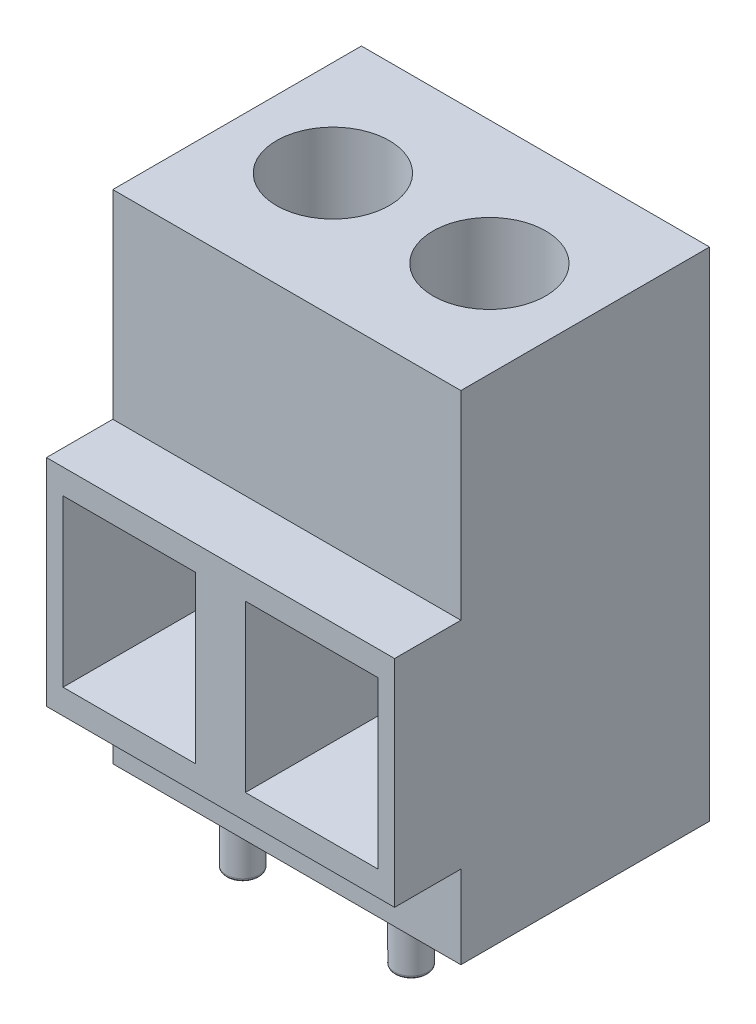
ISO-10303-21;
HEADER;
FILE_DESCRIPTION(('STEP AP214'),'2;1');
FILE_NAME('part.step','',(''),(''),'','','');
FILE_SCHEMA(('AUTOMOTIVE_DESIGN { 1 0 10303 214 1 1 1 1 }'));
ENDSEC;
DATA;
#1=APPLICATION_CONTEXT('core data for automotive mechanical design processes');
#2=APPLICATION_PROTOCOL_DEFINITION('international standard','automotive_design',2000,#1);
#3=PRODUCT_CONTEXT('',#1,'mechanical');
#4=PRODUCT('Part','Part','',(#3));
#5=PRODUCT_RELATED_PRODUCT_CATEGORY('part','',(#4));
#6=PRODUCT_DEFINITION_FORMATION('','',#4);
#7=PRODUCT_DEFINITION_CONTEXT('part definition',#1,'design');
#8=PRODUCT_DEFINITION('design','',#6,#7);
#9=PRODUCT_DEFINITION_SHAPE('','',#8);
#10=(LENGTH_UNIT() NAMED_UNIT(*) SI_UNIT(.MILLI.,.METRE.));
#11=(NAMED_UNIT(*) PLANE_ANGLE_UNIT() SI_UNIT($,.RADIAN.));
#12=(NAMED_UNIT(*) SI_UNIT($,.STERADIAN.) SOLID_ANGLE_UNIT());
#13=UNCERTAINTY_MEASURE_WITH_UNIT(LENGTH_MEASURE(1.E-05),#10,'distance_accuracy_value','');
#14=(GEOMETRIC_REPRESENTATION_CONTEXT(3) GLOBAL_UNCERTAINTY_ASSIGNED_CONTEXT((#13)) GLOBAL_UNIT_ASSIGNED_CONTEXT((#10,
#11,#12)) REPRESENTATION_CONTEXT('',''));
#15=CARTESIAN_POINT('',(0.,0.,0.));
#16=DIRECTION('',(0.,0.,1.));
#17=DIRECTION('',(1.,0.,0.));
#18=AXIS2_PLACEMENT_3D('',#15,#16,#17);
#19=CARTESIAN_POINT('',(4.72,7.,0.));
#20=DIRECTION('',(0.,1.,0.));
#21=DIRECTION('',(0.,0.,1.));
#22=AXIS2_PLACEMENT_3D('',#19,#20,#21);
#23=PLANE('',#22);
#24=CARTESIAN_POINT('',(4.72,7.,0.));
#25=DIRECTION('',(0.,1.,0.));
#26=DIRECTION('',(0.,0.,1.));
#27=AXIS2_PLACEMENT_3D('',#24,#25,#26);
#28=CIRCLE('',#27,3.4);
#29=CARTESIAN_POINT('',(8.08303434416005,7.,-0.5));
#30=VERTEX_POINT('',#29);
#31=CARTESIAN_POINT('',(1.35696565583995,7.,-0.5));
#32=VERTEX_POINT('',#31);
#33=EDGE_CURVE('E225',#30,#32,#28,.T.);
#34=ORIENTED_EDGE('',*,*,#33,.T.);
#35=DIRECTION('',(1.,0.,0.));
#36=VECTOR('',#35,1.);
#37=CARTESIAN_POINT('',(1.35696565583995,7.,-0.5));
#38=LINE('',#37,#36);
#39=EDGE_CURVE('E240',#32,#30,#38,.T.);
#40=ORIENTED_EDGE('',*,*,#39,.T.);
#41=EDGE_LOOP('',(#34,#40));
#42=FACE_BOUND('',#41,.T.);
#43=ADVANCED_FACE('F40',(#42),#23,.T.);
#44=CARTESIAN_POINT('',(-4.72,7.,0.));
#45=DIRECTION('',(0.,1.,0.));
#46=DIRECTION('',(0.,0.,1.));
#47=AXIS2_PLACEMENT_3D('',#44,#45,#46);
#48=PLANE('',#47);
#49=CARTESIAN_POINT('',(-4.72,7.,0.));
#50=DIRECTION('',(0.,1.,0.));
#51=DIRECTION('',(0.,0.,1.));
#52=AXIS2_PLACEMENT_3D('',#49,#50,#51);
#53=CIRCLE('',#52,3.4);
#54=CARTESIAN_POINT('',(-1.35696565583995,7.,-0.5));
#55=VERTEX_POINT('',#54);
#56=CARTESIAN_POINT('',(-8.08303434416005,7.,-0.5));
#57=VERTEX_POINT('',#56);
#58=EDGE_CURVE('E373',#55,#57,#53,.T.);
#59=ORIENTED_EDGE('',*,*,#58,.T.);
#60=DIRECTION('',(1.,0.,0.));
#61=VECTOR('',#60,1.);
#62=CARTESIAN_POINT('',(0.,7.,-0.5));
#63=LINE('',#62,#61);
#64=EDGE_CURVE('E227',#57,#55,#63,.T.);
#65=ORIENTED_EDGE('',*,*,#64,.T.);
#66=EDGE_LOOP('',(#59,#65));
#67=FACE_BOUND('',#66,.T.);
#68=ADVANCED_FACE('F520',(#67),#48,.T.);
#69=CARTESIAN_POINT('',(10.5,-15.,0.));
#70=DIRECTION('',(0.,1.,0.));
#71=DIRECTION('',(0.,0.,1.));
#72=AXIS2_PLACEMENT_3D('',#69,#70,#71);
#73=PLANE('',#72);
#74=CARTESIAN_POINT('',(-5.08,-15.,-5.08));
#75=DIRECTION('',(0.,1.,0.));
#76=DIRECTION('',(0.,0.,1.));
#77=AXIS2_PLACEMENT_3D('',#74,#75,#76);
#78=CIRCLE('',#77,1.);
#79=CARTESIAN_POINT('',(-5.08,-15.,-4.08));
#80=VERTEX_POINT('',#79);
#81=EDGE_CURVE('E477',#80,#80,#78,.F.);
#82=ORIENTED_EDGE('',*,*,#81,.F.);
#83=EDGE_LOOP('',(#82));
#84=FACE_BOUND('',#83,.T.);
#85=CARTESIAN_POINT('',(5.08,-15.,-5.08));
#86=DIRECTION('',(0.,1.,0.));
#87=DIRECTION('',(0.,0.,1.));
#88=AXIS2_PLACEMENT_3D('',#85,#86,#87);
#89=CIRCLE('',#88,1.);
#90=CARTESIAN_POINT('',(5.08,-15.,-4.08));
#91=VERTEX_POINT('',#90);
#92=EDGE_CURVE('E473',#91,#91,#89,.F.);
#93=ORIENTED_EDGE('',*,*,#92,.F.);
#94=EDGE_LOOP('',(#93));
#95=FACE_BOUND('',#94,.T.);
#96=CARTESIAN_POINT('',(5.08,-15.,5.08));
#97=DIRECTION('',(0.,1.,0.));
#98=DIRECTION('',(0.,0.,1.));
#99=AXIS2_PLACEMENT_3D('',#96,#97,#98);
#100=CIRCLE('',#99,1.);
#101=CARTESIAN_POINT('',(5.08,-15.,6.08));
#102=VERTEX_POINT('',#101);
#103=EDGE_CURVE('E469',#102,#102,#100,.F.);
#104=ORIENTED_EDGE('',*,*,#103,.F.);
#105=EDGE_LOOP('',(#104));
#106=FACE_BOUND('',#105,.T.);
#107=CARTESIAN_POINT('',(-5.08,-15.,5.08));
#108=DIRECTION('',(0.,1.,0.));
#109=DIRECTION('',(0.,0.,1.));
#110=AXIS2_PLACEMENT_3D('',#107,#108,#109);
#111=CIRCLE('',#110,1.);
#112=CARTESIAN_POINT('',(-5.08,-15.,6.08));
#113=VERTEX_POINT('',#112);
#114=EDGE_CURVE('E465',#113,#113,#111,.F.);
#115=ORIENTED_EDGE('',*,*,#114,.F.);
#116=EDGE_LOOP('',(#115));
#117=FACE_BOUND('',#116,.T.);
#118=DIRECTION('',(0.,0.,-1.));
#119=VECTOR('',#118,1.);
#120=CARTESIAN_POINT('',(-10.5,-15.,0.));
#121=LINE('',#120,#119);
#122=CARTESIAN_POINT('',(-10.5,-15.,7.5));
#123=VERTEX_POINT('',#122);
#124=CARTESIAN_POINT('',(-10.5,-15.,-7.5));
#125=VERTEX_POINT('',#124);
#126=EDGE_CURVE('E412',#123,#125,#121,.T.);
#127=ORIENTED_EDGE('',*,*,#126,.T.);
#128=DIRECTION('',(-1.,0.,0.));
#129=VECTOR('',#128,1.);
#130=CARTESIAN_POINT('',(10.5,-15.,-7.5));
#131=LINE('',#130,#129);
#132=CARTESIAN_POINT('',(10.5,-15.,-7.5));
#133=VERTEX_POINT('',#132);
#134=EDGE_CURVE('E461',#133,#125,#131,.T.);
#135=ORIENTED_EDGE('',*,*,#134,.F.);
#136=DIRECTION('',(0.,0.,-1.));
#137=VECTOR('',#136,1.);
#138=CARTESIAN_POINT('',(10.5,-15.,0.));
#139=LINE('',#138,#137);
#140=CARTESIAN_POINT('',(10.5,-15.,7.5));
#141=VERTEX_POINT('',#140);
#142=EDGE_CURVE('E385',#141,#133,#139,.T.);
#143=ORIENTED_EDGE('',*,*,#142,.F.);
#144=DIRECTION('',(-1.,0.,0.));
#145=VECTOR('',#144,1.);
#146=CARTESIAN_POINT('',(10.5,-15.,7.5));
#147=LINE('',#146,#145);
#148=EDGE_CURVE('E439',#141,#123,#147,.T.);
#149=ORIENTED_EDGE('',*,*,#148,.T.);
#150=EDGE_LOOP('',(#127,#135,#143,#149));
#151=FACE_BOUND('',#150,.T.);
#152=ADVANCED_FACE('F527',(#84,#95,#106,#117,#151),#73,.F.);
#153=CARTESIAN_POINT('',(10.5,0.,-7.5));
#154=DIRECTION('',(0.,0.,1.));
#155=DIRECTION('',(1.,0.,0.));
#156=AXIS2_PLACEMENT_3D('',#153,#154,#155);
#157=PLANE('',#156);
#158=DIRECTION('',(0.,1.,0.));
#159=VECTOR('',#158,1.);
#160=CARTESIAN_POINT('',(-10.5,0.,-7.5));
#161=LINE('',#160,#159);
#162=CARTESIAN_POINT('',(-10.5,15.,-7.5));
#163=VERTEX_POINT('',#162);
#164=EDGE_CURVE('E416',#125,#163,#161,.T.);
#165=ORIENTED_EDGE('',*,*,#164,.T.);
#166=DIRECTION('',(-1.,0.,0.));
#167=VECTOR('',#166,1.);
#168=CARTESIAN_POINT('',(10.5,15.,-7.5));
#169=LINE('',#168,#167);
#170=CARTESIAN_POINT('',(10.5,15.,-7.5));
#171=VERTEX_POINT('',#170);
#172=EDGE_CURVE('E458',#171,#163,#169,.T.);
#173=ORIENTED_EDGE('',*,*,#172,.F.);
#174=DIRECTION('',(0.,1.,0.));
#175=VECTOR('',#174,1.);
#176=CARTESIAN_POINT('',(10.5,0.,-7.5));
#177=LINE('',#176,#175);
#178=EDGE_CURVE('E389',#133,#171,#177,.T.);
#179=ORIENTED_EDGE('',*,*,#178,.F.);
#180=ORIENTED_EDGE('',*,*,#134,.T.);
#181=EDGE_LOOP('',(#165,#173,#179,#180));
#182=FACE_BOUND('',#181,.T.);
#183=ADVANCED_FACE('F665',(#182),#157,.F.);
#184=CARTESIAN_POINT('',(10.5,15.,0.));
#185=DIRECTION('',(0.,1.,0.));
#186=DIRECTION('',(0.,0.,1.));
#187=AXIS2_PLACEMENT_3D('',#184,#185,#186);
#188=PLANE('',#187);
#189=CARTESIAN_POINT('',(-4.72,15.,0.));
#190=DIRECTION('',(0.,1.,0.));
#191=DIRECTION('',(0.,0.,1.));
#192=AXIS2_PLACEMENT_3D('',#189,#190,#191);
#193=CIRCLE('',#192,3.4);
#194=CARTESIAN_POINT('',(-4.72,15.,3.4));
#195=VERTEX_POINT('',#194);
#196=EDGE_CURVE('E374',#195,#195,#193,.T.);
#197=ORIENTED_EDGE('',*,*,#196,.F.);
#198=EDGE_LOOP('',(#197));
#199=FACE_BOUND('',#198,.T.);
#200=CARTESIAN_POINT('',(4.72,15.,0.));
#201=DIRECTION('',(0.,1.,0.));
#202=DIRECTION('',(0.,0.,1.));
#203=AXIS2_PLACEMENT_3D('',#200,#201,#202);
#204=CIRCLE('',#203,3.4);
#205=CARTESIAN_POINT('',(4.72,15.,3.4));
#206=VERTEX_POINT('',#205);
#207=EDGE_CURVE('E301',#206,#206,#204,.T.);
#208=ORIENTED_EDGE('',*,*,#207,.F.);
#209=EDGE_LOOP('',(#208));
#210=FACE_BOUND('',#209,.T.);
#211=DIRECTION('',(0.,0.,-1.));
#212=VECTOR('',#211,1.);
#213=CARTESIAN_POINT('',(-10.5,15.,0.));
#214=LINE('',#213,#212);
#215=CARTESIAN_POINT('',(-10.5,15.,7.5));
#216=VERTEX_POINT('',#215);
#217=EDGE_CURVE('E420',#216,#163,#214,.T.);
#218=ORIENTED_EDGE('',*,*,#217,.F.);
#219=DIRECTION('',(-1.,0.,0.));
#220=VECTOR('',#219,1.);
#221=CARTESIAN_POINT('',(10.5,15.,7.5));
#222=LINE('',#221,#220);
#223=CARTESIAN_POINT('',(10.5,15.,7.5));
#224=VERTEX_POINT('',#223);
#225=EDGE_CURVE('E455',#224,#216,#222,.T.);
#226=ORIENTED_EDGE('',*,*,#225,.F.);
#227=DIRECTION('',(0.,0.,-1.));
#228=VECTOR('',#227,1.);
#229=CARTESIAN_POINT('',(10.5,15.,0.));
#230=LINE('',#229,#228);
#231=EDGE_CURVE('E393',#224,#171,#230,.T.);
#232=ORIENTED_EDGE('',*,*,#231,.T.);
#233=ORIENTED_EDGE('',*,*,#172,.T.);
#234=EDGE_LOOP('',(#218,#226,#232,#233));
#235=FACE_BOUND('',#234,.T.);
#236=ADVANCED_FACE('F669',(#199,#210,#235),#188,.T.);
#237=CARTESIAN_POINT('',(10.5,0.,7.5));
#238=DIRECTION('',(0.,0.,1.));
#239=DIRECTION('',(1.,0.,0.));
#240=AXIS2_PLACEMENT_3D('',#237,#238,#239);
#241=PLANE('',#240);
#242=DIRECTION('',(0.,1.,0.));
#243=VECTOR('',#242,1.);
#244=CARTESIAN_POINT('',(-10.5,0.,7.5));
#245=LINE('',#244,#243);
#246=CARTESIAN_POINT('',(-10.5,3.,7.5));
#247=VERTEX_POINT('',#246);
#248=EDGE_CURVE('E424',#247,#216,#245,.T.);
#249=ORIENTED_EDGE('',*,*,#248,.F.);
#250=DIRECTION('',(-1.,0.,0.));
#251=VECTOR('',#250,1.);
#252=CARTESIAN_POINT('',(10.5,3.,7.5));
#253=LINE('',#252,#251);
#254=CARTESIAN_POINT('',(10.5,3.,7.5));
#255=VERTEX_POINT('',#254);
#256=EDGE_CURVE('E452',#255,#247,#253,.T.);
#257=ORIENTED_EDGE('',*,*,#256,.F.);
#258=DIRECTION('',(0.,1.,0.));
#259=VECTOR('',#258,1.);
#260=CARTESIAN_POINT('',(10.5,0.,7.5));
#261=LINE('',#260,#259);
#262=EDGE_CURVE('E397',#255,#224,#261,.T.);
#263=ORIENTED_EDGE('',*,*,#262,.T.);
#264=ORIENTED_EDGE('',*,*,#225,.T.);
#265=EDGE_LOOP('',(#249,#257,#263,#264));
#266=FACE_BOUND('',#265,.T.);
#267=ADVANCED_FACE('F673',(#266),#241,.T.);
#268=CARTESIAN_POINT('',(10.5,3.,0.));
#269=DIRECTION('',(0.,-1.,0.));
#270=DIRECTION('',(0.,0.,-1.));
#271=AXIS2_PLACEMENT_3D('',#268,#269,#270);
#272=PLANE('',#271);
#273=DIRECTION('',(0.,0.,1.));
#274=VECTOR('',#273,1.);
#275=CARTESIAN_POINT('',(-10.5,3.,0.));
#276=LINE('',#275,#274);
#277=CARTESIAN_POINT('',(-10.5,3.,11.5));
#278=VERTEX_POINT('',#277);
#279=EDGE_CURVE('E428',#247,#278,#276,.T.);
#280=ORIENTED_EDGE('',*,*,#279,.T.);
#281=DIRECTION('',(-1.,0.,0.));
#282=VECTOR('',#281,1.);
#283=CARTESIAN_POINT('',(10.5,3.,11.5));
#284=LINE('',#283,#282);
#285=CARTESIAN_POINT('',(10.5,3.,11.5));
#286=VERTEX_POINT('',#285);
#287=EDGE_CURVE('E448',#286,#278,#284,.T.);
#288=ORIENTED_EDGE('',*,*,#287,.F.);
#289=DIRECTION('',(0.,0.,1.));
#290=VECTOR('',#289,1.);
#291=CARTESIAN_POINT('',(10.5,3.,0.));
#292=LINE('',#291,#290);
#293=EDGE_CURVE('E401',#255,#286,#292,.T.);
#294=ORIENTED_EDGE('',*,*,#293,.F.);
#295=ORIENTED_EDGE('',*,*,#256,.T.);
#296=EDGE_LOOP('',(#280,#288,#294,#295));
#297=FACE_BOUND('',#296,.T.);
#298=ADVANCED_FACE('F675',(#297),#272,.F.);
#299=CARTESIAN_POINT('',(10.5,0.,11.5));
#300=DIRECTION('',(0.,0.,-1.));
#301=DIRECTION('',(0.,1.,0.));
#302=AXIS2_PLACEMENT_3D('',#299,#300,#301);
#303=PLANE('',#302);
#304=DIRECTION('',(-1.,0.,0.));
#305=VECTOR('',#304,1.);
#306=CARTESIAN_POINT('',(-9.5,1.5,11.5));
#307=LINE('',#306,#305);
#308=CARTESIAN_POINT('',(-1.5,1.5,11.5));
#309=VERTEX_POINT('',#308);
#310=CARTESIAN_POINT('',(-9.5,1.5,11.5));
#311=VERTEX_POINT('',#310);
#312=EDGE_CURVE('E284',#309,#311,#307,.T.);
#313=ORIENTED_EDGE('',*,*,#312,.F.);
#314=DIRECTION('',(0.,1.,0.));
#315=VECTOR('',#314,1.);
#316=CARTESIAN_POINT('',(-1.5,-8.5,11.5));
#317=LINE('',#316,#315);
#318=CARTESIAN_POINT('',(-1.5,-8.5,11.5));
#319=VERTEX_POINT('',#318);
#320=EDGE_CURVE('E281',#319,#309,#317,.T.);
#321=ORIENTED_EDGE('',*,*,#320,.F.);
#322=DIRECTION('',(1.,0.,0.));
#323=VECTOR('',#322,1.);
#324=CARTESIAN_POINT('',(-9.5,-8.5,11.5));
#325=LINE('',#324,#323);
#326=CARTESIAN_POINT('',(-9.5,-8.5,11.5));
#327=VERTEX_POINT('',#326);
#328=EDGE_CURVE('E293',#327,#319,#325,.T.);
#329=ORIENTED_EDGE('',*,*,#328,.F.);
#330=DIRECTION('',(0.,-1.,0.));
#331=VECTOR('',#330,1.);
#332=CARTESIAN_POINT('',(-9.5,-8.5,11.5));
#333=LINE('',#332,#331);
#334=EDGE_CURVE('E289',#311,#327,#333,.T.);
#335=ORIENTED_EDGE('',*,*,#334,.F.);
#336=EDGE_LOOP('',(#313,#321,#329,#335));
#337=FACE_BOUND('',#336,.T.);
#338=DIRECTION('',(-1.,0.,0.));
#339=VECTOR('',#338,1.);
#340=CARTESIAN_POINT('',(1.5,1.5,11.5));
#341=LINE('',#340,#339);
#342=CARTESIAN_POINT('',(9.5,1.5,11.5));
#343=VERTEX_POINT('',#342);
#344=CARTESIAN_POINT('',(1.5,1.5,11.5));
#345=VERTEX_POINT('',#344);
#346=EDGE_CURVE('E329',#343,#345,#341,.T.);
#347=ORIENTED_EDGE('',*,*,#346,.F.);
#348=DIRECTION('',(0.,1.,0.));
#349=VECTOR('',#348,1.);
#350=CARTESIAN_POINT('',(9.5,-8.5,11.5));
#351=LINE('',#350,#349);
#352=CARTESIAN_POINT('',(9.5,-8.5,11.5));
#353=VERTEX_POINT('',#352);
#354=EDGE_CURVE('E272',#353,#343,#351,.T.);
#355=ORIENTED_EDGE('',*,*,#354,.F.);
#356=DIRECTION('',(1.,0.,0.));
#357=VECTOR('',#356,1.);
#358=CARTESIAN_POINT('',(1.5,-8.5,11.5));
#359=LINE('',#358,#357);
#360=CARTESIAN_POINT('',(1.5,-8.5,11.5));
#361=VERTEX_POINT('',#360);
#362=EDGE_CURVE('E337',#361,#353,#359,.T.);
#363=ORIENTED_EDGE('',*,*,#362,.F.);
#364=DIRECTION('',(0.,-1.,0.));
#365=VECTOR('',#364,1.);
#366=CARTESIAN_POINT('',(1.5,-8.5,11.5));
#367=LINE('',#366,#365);
#368=EDGE_CURVE('E333',#345,#361,#367,.T.);
#369=ORIENTED_EDGE('',*,*,#368,.F.);
#370=EDGE_LOOP('',(#347,#355,#363,#369));
#371=FACE_BOUND('',#370,.T.);
#372=DIRECTION('',(0.,-1.,0.));
#373=VECTOR('',#372,1.);
#374=CARTESIAN_POINT('',(-10.5,0.,11.5));
#375=LINE('',#374,#373);
#376=CARTESIAN_POINT('',(-10.5,-10.,11.5));
#377=VERTEX_POINT('',#376);
#378=EDGE_CURVE('E431',#278,#377,#375,.T.);
#379=ORIENTED_EDGE('',*,*,#378,.T.);
#380=DIRECTION('',(-1.,0.,0.));
#381=VECTOR('',#380,1.);
#382=CARTESIAN_POINT('',(10.5,-10.,11.5));
#383=LINE('',#382,#381);
#384=CARTESIAN_POINT('',(10.5,-10.,11.5));
#385=VERTEX_POINT('',#384);
#386=EDGE_CURVE('E445',#385,#377,#383,.T.);
#387=ORIENTED_EDGE('',*,*,#386,.F.);
#388=DIRECTION('',(0.,-1.,0.));
#389=VECTOR('',#388,1.);
#390=CARTESIAN_POINT('',(10.5,0.,11.5));
#391=LINE('',#390,#389);
#392=EDGE_CURVE('E405',#286,#385,#391,.T.);
#393=ORIENTED_EDGE('',*,*,#392,.F.);
#394=ORIENTED_EDGE('',*,*,#287,.T.);
#395=EDGE_LOOP('',(#379,#387,#393,#394));
#396=FACE_BOUND('',#395,.T.);
#397=ADVANCED_FACE('F678',(#337,#371,#396),#303,.F.);
#398=CARTESIAN_POINT('',(10.5,-10.,0.));
#399=DIRECTION('',(0.,-1.,0.));
#400=DIRECTION('',(0.,0.,-1.));
#401=AXIS2_PLACEMENT_3D('',#398,#399,#400);
#402=PLANE('',#401);
#403=DIRECTION('',(0.,0.,1.));
#404=VECTOR('',#403,1.);
#405=CARTESIAN_POINT('',(-10.5,-10.,0.));
#406=LINE('',#405,#404);
#407=CARTESIAN_POINT('',(-10.5,-10.,7.5));
#408=VERTEX_POINT('',#407);
#409=EDGE_CURVE('E435',#408,#377,#406,.T.);
#410=ORIENTED_EDGE('',*,*,#409,.F.);
#411=DIRECTION('',(-1.,0.,0.));
#412=VECTOR('',#411,1.);
#413=CARTESIAN_POINT('',(10.5,-10.,7.5));
#414=LINE('',#413,#412);
#415=CARTESIAN_POINT('',(10.5,-10.,7.5));
#416=VERTEX_POINT('',#415);
#417=EDGE_CURVE('E442',#416,#408,#414,.T.);
#418=ORIENTED_EDGE('',*,*,#417,.F.);
#419=DIRECTION('',(0.,0.,1.));
#420=VECTOR('',#419,1.);
#421=CARTESIAN_POINT('',(10.5,-10.,0.));
#422=LINE('',#421,#420);
#423=EDGE_CURVE('E408',#416,#385,#422,.T.);
#424=ORIENTED_EDGE('',*,*,#423,.T.);
#425=ORIENTED_EDGE('',*,*,#386,.T.);
#426=EDGE_LOOP('',(#410,#418,#424,#425));
#427=FACE_BOUND('',#426,.T.);
#428=ADVANCED_FACE('F682',(#427),#402,.T.);
#429=EDGE_CURVE('E390',#123,#408,#245,.T.);
#430=ORIENTED_EDGE('',*,*,#429,.F.);
#431=ORIENTED_EDGE('',*,*,#148,.F.);
#432=EDGE_CURVE('E402',#141,#416,#261,.T.);
#433=ORIENTED_EDGE('',*,*,#432,.T.);
#434=ORIENTED_EDGE('',*,*,#417,.T.);
#435=EDGE_LOOP('',(#430,#431,#433,#434));
#436=FACE_BOUND('',#435,.T.);
#437=ADVANCED_FACE('F686',(#436),#241,.T.);
#438=CARTESIAN_POINT('',(10.5,0.,0.));
#439=DIRECTION('',(1.,0.,0.));
#440=DIRECTION('',(0.,0.,-1.));
#441=AXIS2_PLACEMENT_3D('',#438,#439,#440);
#442=PLANE('',#441);
#443=ORIENTED_EDGE('',*,*,#142,.T.);
#444=ORIENTED_EDGE('',*,*,#178,.T.);
#445=ORIENTED_EDGE('',*,*,#231,.F.);
#446=ORIENTED_EDGE('',*,*,#262,.F.);
#447=ORIENTED_EDGE('',*,*,#293,.T.);
#448=ORIENTED_EDGE('',*,*,#392,.T.);
#449=ORIENTED_EDGE('',*,*,#423,.F.);
#450=ORIENTED_EDGE('',*,*,#432,.F.);
#451=EDGE_LOOP('',(#443,#444,#445,#446,#447,#448,#449,#450));
#452=FACE_BOUND('',#451,.T.);
#453=ADVANCED_FACE('F690',(#452),#442,.T.);
#454=CARTESIAN_POINT('',(-10.5,0.,0.));
#455=DIRECTION('',(1.,0.,0.));
#456=DIRECTION('',(0.,0.,-1.));
#457=AXIS2_PLACEMENT_3D('',#454,#455,#456);
#458=PLANE('',#457);
#459=ORIENTED_EDGE('',*,*,#126,.F.);
#460=ORIENTED_EDGE('',*,*,#429,.T.);
#461=ORIENTED_EDGE('',*,*,#409,.T.);
#462=ORIENTED_EDGE('',*,*,#378,.F.);
#463=ORIENTED_EDGE('',*,*,#279,.F.);
#464=ORIENTED_EDGE('',*,*,#248,.T.);
#465=ORIENTED_EDGE('',*,*,#217,.T.);
#466=ORIENTED_EDGE('',*,*,#164,.F.);
#467=EDGE_LOOP('',(#459,#460,#461,#462,#463,#464,#465,#466));
#468=FACE_BOUND('',#467,.T.);
#469=ADVANCED_FACE('F541',(#468),#458,.F.);
#470=CARTESIAN_POINT('',(4.72,7.,0.));
#471=DIRECTION('',(0.,1.,0.));
#472=DIRECTION('',(0.,0.,1.));
#473=AXIS2_PLACEMENT_3D('',#470,#471,#472);
#474=CYLINDRICAL_SURFACE('',#473,3.4);
#475=ORIENTED_EDGE('',*,*,#33,.F.);
#476=DIRECTION('',(0.,1.,0.));
#477=VECTOR('',#476,1.);
#478=CARTESIAN_POINT('',(8.08303434416005,6.,-0.5));
#479=LINE('',#478,#477);
#480=CARTESIAN_POINT('',(8.08303434416005,6.,-0.5));
#481=VERTEX_POINT('',#480);
#482=EDGE_CURVE('E207',#481,#30,#479,.T.);
#483=ORIENTED_EDGE('',*,*,#482,.F.);
#484=CARTESIAN_POINT('',(4.72,6.,0.));
#485=DIRECTION('',(0.,1.,0.));
#486=DIRECTION('',(0.,0.,1.));
#487=AXIS2_PLACEMENT_3D('',#484,#485,#486);
#488=CIRCLE('',#487,3.4);
#489=CARTESIAN_POINT('',(8.08303434416005,6.,0.5));
#490=VERTEX_POINT('',#489);
#491=EDGE_CURVE('E215',#490,#481,#488,.T.);
#492=ORIENTED_EDGE('',*,*,#491,.F.);
#493=DIRECTION('',(0.,1.,0.));
#494=VECTOR('',#493,1.);
#495=CARTESIAN_POINT('',(8.08303434416005,6.,0.5));
#496=LINE('',#495,#494);
#497=CARTESIAN_POINT('',(8.08303434416005,7.,0.5));
#498=VERTEX_POINT('',#497);
#499=EDGE_CURVE('E228',#490,#498,#496,.T.);
#500=ORIENTED_EDGE('',*,*,#499,.T.);
#501=CARTESIAN_POINT('',(1.35696565583995,7.,0.5));
#502=VERTEX_POINT('',#501);
#503=EDGE_CURVE('E378',#502,#498,#28,.T.);
#504=ORIENTED_EDGE('',*,*,#503,.F.);
#505=DIRECTION('',(0.,1.,0.));
#506=VECTOR('',#505,1.);
#507=CARTESIAN_POINT('',(1.35696565583995,6.,0.499999999999999));
#508=LINE('',#507,#506);
#509=CARTESIAN_POINT('',(1.35696565583995,6.,0.499999999999999));
#510=VERTEX_POINT('',#509);
#511=EDGE_CURVE('E56',#510,#502,#508,.T.);
#512=ORIENTED_EDGE('',*,*,#511,.F.);
#513=CARTESIAN_POINT('',(4.72,6.,0.));
#514=DIRECTION('',(0.,1.,0.));
#515=DIRECTION('',(0.,0.,1.));
#516=AXIS2_PLACEMENT_3D('',#513,#514,#515);
#517=CIRCLE('',#516,3.4);
#518=CARTESIAN_POINT('',(1.35696565583995,6.,-0.5));
#519=VERTEX_POINT('',#518);
#520=EDGE_CURVE('E236',#519,#510,#517,.T.);
#521=ORIENTED_EDGE('',*,*,#520,.F.);
#522=DIRECTION('',(0.,1.,0.));
#523=VECTOR('',#522,1.);
#524=CARTESIAN_POINT('',(1.35696565583995,6.,-0.5));
#525=LINE('',#524,#523);
#526=EDGE_CURVE('E209',#519,#32,#525,.T.);
#527=ORIENTED_EDGE('',*,*,#526,.T.);
#528=EDGE_LOOP('',(#475,#483,#492,#500,#504,#512,#521,#527));
#529=FACE_BOUND('',#528,.T.);
#530=ORIENTED_EDGE('',*,*,#207,.T.);
#531=EDGE_LOOP('',(#530));
#532=FACE_BOUND('',#531,.T.);
#533=ADVANCED_FACE('F221',(#529,#532),#474,.F.);
#534=DIRECTION('',(1.,0.,0.));
#535=VECTOR('',#534,1.);
#536=CARTESIAN_POINT('',(1.35696565583995,7.,0.5));
#537=LINE('',#536,#535);
#538=EDGE_CURVE('E216',#502,#498,#537,.T.);
#539=ORIENTED_EDGE('',*,*,#538,.F.);
#540=ORIENTED_EDGE('',*,*,#503,.T.);
#541=EDGE_LOOP('',(#539,#540));
#542=FACE_BOUND('',#541,.T.);
#543=ADVANCED_FACE('F523',(#542),#23,.T.);
#544=CARTESIAN_POINT('',(-4.72,7.,0.));
#545=DIRECTION('',(0.,1.,0.));
#546=DIRECTION('',(0.,0.,1.));
#547=AXIS2_PLACEMENT_3D('',#544,#545,#546);
#548=CYLINDRICAL_SURFACE('',#547,3.4);
#549=ORIENTED_EDGE('',*,*,#58,.F.);
#550=DIRECTION('',(0.,1.,0.));
#551=VECTOR('',#550,1.);
#552=CARTESIAN_POINT('',(-1.35696565583995,6.,-0.5));
#553=LINE('',#552,#551);
#554=CARTESIAN_POINT('',(-1.35696565583995,6.,-0.5));
#555=VERTEX_POINT('',#554);
#556=EDGE_CURVE('E269',#555,#55,#553,.T.);
#557=ORIENTED_EDGE('',*,*,#556,.F.);
#558=CARTESIAN_POINT('',(-4.72,6.,0.));
#559=DIRECTION('',(0.,1.,0.));
#560=DIRECTION('',(0.,0.,1.));
#561=AXIS2_PLACEMENT_3D('',#558,#559,#560);
#562=CIRCLE('',#561,3.4);
#563=CARTESIAN_POINT('',(-1.35696565583995,6.,0.5));
#564=VERTEX_POINT('',#563);
#565=EDGE_CURVE('E260',#564,#555,#562,.T.);
#566=ORIENTED_EDGE('',*,*,#565,.F.);
#567=DIRECTION('',(0.,1.,0.));
#568=VECTOR('',#567,1.);
#569=CARTESIAN_POINT('',(-1.35696565583995,6.,0.5));
#570=LINE('',#569,#568);
#571=CARTESIAN_POINT('',(-1.35696565583995,7.,0.5));
#572=VERTEX_POINT('',#571);
#573=EDGE_CURVE('E273',#564,#572,#570,.T.);
#574=ORIENTED_EDGE('',*,*,#573,.T.);
#575=CARTESIAN_POINT('',(-8.08303434416005,7.,0.5));
#576=VERTEX_POINT('',#575);
#577=EDGE_CURVE('E369',#576,#572,#53,.T.);
#578=ORIENTED_EDGE('',*,*,#577,.F.);
#579=DIRECTION('',(0.,1.,0.));
#580=VECTOR('',#579,1.);
#581=CARTESIAN_POINT('',(-8.08303434416005,6.,0.5));
#582=LINE('',#581,#580);
#583=CARTESIAN_POINT('',(-8.08303434416005,6.,0.5));
#584=VERTEX_POINT('',#583);
#585=EDGE_CURVE('E64',#584,#576,#582,.T.);
#586=ORIENTED_EDGE('',*,*,#585,.F.);
#587=CARTESIAN_POINT('',(-8.08303434416005,6.,-0.5));
#588=VERTEX_POINT('',#587);
#589=EDGE_CURVE('E254',#588,#584,#562,.T.);
#590=ORIENTED_EDGE('',*,*,#589,.F.);
#591=DIRECTION('',(0.,1.,0.));
#592=VECTOR('',#591,1.);
#593=CARTESIAN_POINT('',(-8.08303434416005,6.,-0.5));
#594=LINE('',#593,#592);
#595=EDGE_CURVE('E278',#588,#57,#594,.T.);
#596=ORIENTED_EDGE('',*,*,#595,.T.);
#597=EDGE_LOOP('',(#549,#557,#566,#574,#578,#586,#590,#596));
#598=FACE_BOUND('',#597,.T.);
#599=ORIENTED_EDGE('',*,*,#196,.T.);
#600=EDGE_LOOP('',(#599));
#601=FACE_BOUND('',#600,.T.);
#602=ADVANCED_FACE('F534',(#598,#601),#548,.F.);
#603=DIRECTION('',(1.,0.,0.));
#604=VECTOR('',#603,1.);
#605=CARTESIAN_POINT('',(0.,7.,0.5));
#606=LINE('',#605,#604);
#607=EDGE_CURVE('E255',#576,#572,#606,.T.);
#608=ORIENTED_EDGE('',*,*,#607,.F.);
#609=ORIENTED_EDGE('',*,*,#577,.T.);
#610=EDGE_LOOP('',(#608,#609));
#611=FACE_BOUND('',#610,.T.);
#612=ADVANCED_FACE('F530',(#611),#48,.T.);
#613=CARTESIAN_POINT('',(9.5,-8.5,11.5));
#614=DIRECTION('',(0.994521895368273,0.,-0.104528463267654));
#615=DIRECTION('',(-0.104528463267654,0.,-0.994521895368273));
#616=AXIS2_PLACEMENT_3D('',#613,#614,#615);
#617=PLANE('',#616);
#618=ORIENTED_EDGE('',*,*,#354,.T.);
#619=DIRECTION('',(0.103962051184498,0.103962051184498,0.989132844377854));
#620=VECTOR('',#619,1.);
#621=CARTESIAN_POINT('',(9.39191891913512,1.39191891913512,10.4716772060452));
#622=LINE('',#621,#620);
#623=CARTESIAN_POINT('',(7.81833223574917,-0.181667764250827,-4.5));
#624=VERTEX_POINT('',#623);
#625=EDGE_CURVE('E345',#624,#343,#622,.T.);
#626=ORIENTED_EDGE('',*,*,#625,.F.);
#627=DIRECTION('',(0.,1.,0.));
#628=VECTOR('',#627,1.);
#629=CARTESIAN_POINT('',(7.81833223574917,-8.5,-4.5));
#630=LINE('',#629,#628);
#631=CARTESIAN_POINT('',(7.81833223574917,-6.81833223574917,-4.5));
#632=VERTEX_POINT('',#631);
#633=EDGE_CURVE('E341',#632,#624,#630,.T.);
#634=ORIENTED_EDGE('',*,*,#633,.F.);
#635=DIRECTION('',(0.103962051184498,-0.103962051184498,0.989132844377854));
#636=VECTOR('',#635,1.);
#637=CARTESIAN_POINT('',(9.4135351353081,-8.4135351353081,10.6773417648362));
#638=LINE('',#637,#636);
#639=EDGE_CURVE('E285',#632,#353,#638,.T.);
#640=ORIENTED_EDGE('',*,*,#639,.T.);
#641=EDGE_LOOP('',(#618,#626,#634,#640));
#642=FACE_BOUND('',#641,.T.);
#643=ADVANCED_FACE('F564',(#642),#617,.F.);
#644=CARTESIAN_POINT('',(1.5,-8.5,11.5));
#645=DIRECTION('',(0.,-0.994521895368273,-0.104528463267654));
#646=DIRECTION('',(0.,0.104528463267654,-0.994521895368273));
#647=AXIS2_PLACEMENT_3D('',#644,#645,#646);
#648=PLANE('',#647);
#649=ORIENTED_EDGE('',*,*,#362,.T.);
#650=ORIENTED_EDGE('',*,*,#639,.F.);
#651=DIRECTION('',(1.,0.,0.));
#652=VECTOR('',#651,1.);
#653=CARTESIAN_POINT('',(1.5,-6.81833223574917,-4.5));
#654=LINE('',#653,#652);
#655=CARTESIAN_POINT('',(3.18166776425083,-6.81833223574917,-4.5));
#656=VERTEX_POINT('',#655);
#657=EDGE_CURVE('E350',#656,#632,#654,.T.);
#658=ORIENTED_EDGE('',*,*,#657,.F.);
#659=DIRECTION('',(-0.103962051184498,-0.103962051184498,0.989132844377854));
#660=VECTOR('',#659,1.);
#661=CARTESIAN_POINT('',(1.5,-8.5,11.5));
#662=LINE('',#661,#660);
#663=EDGE_CURVE('E344',#656,#361,#662,.T.);
#664=ORIENTED_EDGE('',*,*,#663,.T.);
#665=EDGE_LOOP('',(#649,#650,#658,#664));
#666=FACE_BOUND('',#665,.T.);
#667=ADVANCED_FACE('F568',(#666),#648,.F.);
#668=CARTESIAN_POINT('',(1.5,-8.5,11.5));
#669=DIRECTION('',(-0.994521895368273,0.,-0.104528463267654));
#670=DIRECTION('',(-0.104528463267654,0.,0.994521895368273));
#671=AXIS2_PLACEMENT_3D('',#668,#669,#670);
#672=PLANE('',#671);
#673=ORIENTED_EDGE('',*,*,#368,.T.);
#674=ORIENTED_EDGE('',*,*,#663,.F.);
#675=DIRECTION('',(0.,-1.,0.));
#676=VECTOR('',#675,1.);
#677=CARTESIAN_POINT('',(3.18166776425083,-8.5,-4.5));
#678=LINE('',#677,#676);
#679=CARTESIAN_POINT('',(3.18166776425083,-0.181667764250827,-4.5));
#680=VERTEX_POINT('',#679);
#681=EDGE_CURVE('E362',#680,#656,#678,.T.);
#682=ORIENTED_EDGE('',*,*,#681,.F.);
#683=DIRECTION('',(-0.103962051184498,0.103962051184498,0.989132844377854));
#684=VECTOR('',#683,1.);
#685=CARTESIAN_POINT('',(1.5,1.5,11.5));
#686=LINE('',#685,#684);
#687=EDGE_CURVE('E349',#680,#345,#686,.T.);
#688=ORIENTED_EDGE('',*,*,#687,.T.);
#689=EDGE_LOOP('',(#673,#674,#682,#688));
#690=FACE_BOUND('',#689,.T.);
#691=ADVANCED_FACE('F574',(#690),#672,.F.);
#692=CARTESIAN_POINT('',(1.5,1.5,11.5));
#693=DIRECTION('',(0.,0.994521895368273,-0.104528463267654));
#694=DIRECTION('',(0.,0.104528463267654,0.994521895368273));
#695=AXIS2_PLACEMENT_3D('',#692,#693,#694);
#696=PLANE('',#695);
#697=ORIENTED_EDGE('',*,*,#346,.T.);
#698=ORIENTED_EDGE('',*,*,#687,.F.);
#699=DIRECTION('',(-1.,0.,0.));
#700=VECTOR('',#699,1.);
#701=CARTESIAN_POINT('',(1.5,-0.181667764250827,-4.5));
#702=LINE('',#701,#700);
#703=EDGE_CURVE('E358',#624,#680,#702,.T.);
#704=ORIENTED_EDGE('',*,*,#703,.F.);
#705=ORIENTED_EDGE('',*,*,#625,.T.);
#706=EDGE_LOOP('',(#697,#698,#704,#705));
#707=FACE_BOUND('',#706,.T.);
#708=ADVANCED_FACE('F578',(#707),#696,.F.);
#709=CARTESIAN_POINT('',(0.,0.,-4.5));
#710=DIRECTION('',(0.,0.,-1.));
#711=DIRECTION('',(-1.,0.,0.));
#712=AXIS2_PLACEMENT_3D('',#709,#710,#711);
#713=PLANE('',#712);
#714=ORIENTED_EDGE('',*,*,#633,.T.);
#715=ORIENTED_EDGE('',*,*,#703,.T.);
#716=ORIENTED_EDGE('',*,*,#681,.T.);
#717=ORIENTED_EDGE('',*,*,#657,.T.);
#718=EDGE_LOOP('',(#714,#715,#716,#717));
#719=FACE_BOUND('',#718,.T.);
#720=ADVANCED_FACE('F581',(#719),#713,.F.);
#721=CARTESIAN_POINT('',(-1.5,-8.5,11.5));
#722=DIRECTION('',(0.994521895368273,0.,-0.104528463267654));
#723=DIRECTION('',(-0.104528463267654,0.,-0.994521895368273));
#724=AXIS2_PLACEMENT_3D('',#721,#722,#723);
#725=PLANE('',#724);
#726=ORIENTED_EDGE('',*,*,#320,.T.);
#727=DIRECTION('',(0.103962051184498,0.103962051184498,0.989132844377854));
#728=VECTOR('',#727,1.);
#729=CARTESIAN_POINT('',(-1.60808108086488,1.39191891913512,10.4716772060452));
#730=LINE('',#729,#728);
#731=CARTESIAN_POINT('',(-3.18166776425083,-0.181667764250828,-4.5));
#732=VERTEX_POINT('',#731);
#733=EDGE_CURVE('E303',#732,#309,#730,.T.);
#734=ORIENTED_EDGE('',*,*,#733,.F.);
#735=DIRECTION('',(0.,1.,0.));
#736=VECTOR('',#735,1.);
#737=CARTESIAN_POINT('',(-3.18166776425082,-8.5,-4.5));
#738=LINE('',#737,#736);
#739=CARTESIAN_POINT('',(-3.18166776425082,-6.81833223574917,-4.5));
#740=VERTEX_POINT('',#739);
#741=EDGE_CURVE('E297',#740,#732,#738,.T.);
#742=ORIENTED_EDGE('',*,*,#741,.F.);
#743=DIRECTION('',(0.103962051184498,-0.103962051184498,0.989132844377854));
#744=VECTOR('',#743,1.);
#745=CARTESIAN_POINT('',(-1.5864648646919,-8.4135351353081,10.6773417648362));
#746=LINE('',#745,#744);
#747=EDGE_CURVE('E298',#740,#319,#746,.T.);
#748=ORIENTED_EDGE('',*,*,#747,.T.);
#749=EDGE_LOOP('',(#726,#734,#742,#748));
#750=FACE_BOUND('',#749,.T.);
#751=ADVANCED_FACE('F586',(#750),#725,.F.);
#752=CARTESIAN_POINT('',(-9.5,-8.5,11.5));
#753=DIRECTION('',(0.,-0.994521895368273,-0.104528463267654));
#754=DIRECTION('',(0.,0.104528463267654,-0.994521895368273));
#755=AXIS2_PLACEMENT_3D('',#752,#753,#754);
#756=PLANE('',#755);
#757=ORIENTED_EDGE('',*,*,#328,.T.);
#758=ORIENTED_EDGE('',*,*,#747,.F.);
#759=DIRECTION('',(1.,0.,0.));
#760=VECTOR('',#759,1.);
#761=CARTESIAN_POINT('',(-9.5,-6.81833223574917,-4.5));
#762=LINE('',#761,#760);
#763=CARTESIAN_POINT('',(-7.81833223574917,-6.81833223574917,-4.5));
#764=VERTEX_POINT('',#763);
#765=EDGE_CURVE('E308',#764,#740,#762,.T.);
#766=ORIENTED_EDGE('',*,*,#765,.F.);
#767=DIRECTION('',(-0.103962051184498,-0.103962051184498,0.989132844377854));
#768=VECTOR('',#767,1.);
#769=CARTESIAN_POINT('',(-9.5,-8.5,11.5));
#770=LINE('',#769,#768);
#771=EDGE_CURVE('E302',#764,#327,#770,.T.);
#772=ORIENTED_EDGE('',*,*,#771,.T.);
#773=EDGE_LOOP('',(#757,#758,#766,#772));
#774=FACE_BOUND('',#773,.T.);
#775=ADVANCED_FACE('F588',(#774),#756,.F.);
#776=CARTESIAN_POINT('',(-9.5,-8.5,11.5));
#777=DIRECTION('',(-0.994521895368273,0.,-0.104528463267654));
#778=DIRECTION('',(-0.104528463267654,0.,0.994521895368273));
#779=AXIS2_PLACEMENT_3D('',#776,#777,#778);
#780=PLANE('',#779);
#781=ORIENTED_EDGE('',*,*,#334,.T.);
#782=ORIENTED_EDGE('',*,*,#771,.F.);
#783=DIRECTION('',(0.,-1.,0.));
#784=VECTOR('',#783,1.);
#785=CARTESIAN_POINT('',(-7.81833223574917,-8.5,-4.5));
#786=LINE('',#785,#784);
#787=CARTESIAN_POINT('',(-7.81833223574917,-0.181667764250828,-4.5));
#788=VERTEX_POINT('',#787);
#789=EDGE_CURVE('E320',#788,#764,#786,.T.);
#790=ORIENTED_EDGE('',*,*,#789,.F.);
#791=DIRECTION('',(-0.103962051184498,0.103962051184498,0.989132844377854));
#792=VECTOR('',#791,1.);
#793=CARTESIAN_POINT('',(-9.5,1.5,11.5));
#794=LINE('',#793,#792);
#795=EDGE_CURVE('E307',#788,#311,#794,.T.);
#796=ORIENTED_EDGE('',*,*,#795,.T.);
#797=EDGE_LOOP('',(#781,#782,#790,#796));
#798=FACE_BOUND('',#797,.T.);
#799=ADVANCED_FACE('F591',(#798),#780,.F.);
#800=CARTESIAN_POINT('',(-9.5,1.5,11.5));
#801=DIRECTION('',(0.,0.994521895368273,-0.104528463267654));
#802=DIRECTION('',(0.,0.104528463267654,0.994521895368273));
#803=AXIS2_PLACEMENT_3D('',#800,#801,#802);
#804=PLANE('',#803);
#805=ORIENTED_EDGE('',*,*,#312,.T.);
#806=ORIENTED_EDGE('',*,*,#795,.F.);
#807=DIRECTION('',(-1.,0.,0.));
#808=VECTOR('',#807,1.);
#809=CARTESIAN_POINT('',(-9.5,-0.181667764250828,-4.5));
#810=LINE('',#809,#808);
#811=EDGE_CURVE('E316',#732,#788,#810,.T.);
#812=ORIENTED_EDGE('',*,*,#811,.F.);
#813=ORIENTED_EDGE('',*,*,#733,.T.);
#814=EDGE_LOOP('',(#805,#806,#812,#813));
#815=FACE_BOUND('',#814,.T.);
#816=ADVANCED_FACE('F595',(#815),#804,.F.);
#817=CARTESIAN_POINT('',(0.,0.,-4.5));
#818=DIRECTION('',(0.,0.,-1.));
#819=DIRECTION('',(-1.,0.,0.));
#820=AXIS2_PLACEMENT_3D('',#817,#818,#819);
#821=PLANE('',#820);
#822=ORIENTED_EDGE('',*,*,#741,.T.);
#823=ORIENTED_EDGE('',*,*,#811,.T.);
#824=ORIENTED_EDGE('',*,*,#789,.T.);
#825=ORIENTED_EDGE('',*,*,#765,.T.);
#826=EDGE_LOOP('',(#822,#823,#824,#825));
#827=FACE_BOUND('',#826,.T.);
#828=ADVANCED_FACE('F599',(#827),#821,.F.);
#829=CARTESIAN_POINT('',(0.,6.,-0.5));
#830=DIRECTION('',(0.,0.,1.));
#831=DIRECTION('',(1.,0.,0.));
#832=AXIS2_PLACEMENT_3D('',#829,#830,#831);
#833=PLANE('',#832);
#834=ORIENTED_EDGE('',*,*,#64,.F.);
#835=ORIENTED_EDGE('',*,*,#595,.F.);
#836=DIRECTION('',(1.,0.,0.));
#837=VECTOR('',#836,1.);
#838=CARTESIAN_POINT('',(0.,6.,-0.5));
#839=LINE('',#838,#837);
#840=EDGE_CURVE('E251',#588,#555,#839,.T.);
#841=ORIENTED_EDGE('',*,*,#840,.T.);
#842=ORIENTED_EDGE('',*,*,#556,.T.);
#843=EDGE_LOOP('',(#834,#835,#841,#842));
#844=FACE_BOUND('',#843,.T.);
#845=ADVANCED_FACE('F560',(#844),#833,.T.);
#846=CARTESIAN_POINT('',(0.,6.,0.5));
#847=DIRECTION('',(0.,0.,1.));
#848=DIRECTION('',(1.,0.,0.));
#849=AXIS2_PLACEMENT_3D('',#846,#847,#848);
#850=PLANE('',#849);
#851=ORIENTED_EDGE('',*,*,#607,.T.);
#852=ORIENTED_EDGE('',*,*,#573,.F.);
#853=DIRECTION('',(1.,0.,0.));
#854=VECTOR('',#853,1.);
#855=CARTESIAN_POINT('',(0.,6.,0.5));
#856=LINE('',#855,#854);
#857=EDGE_CURVE('E259',#584,#564,#856,.T.);
#858=ORIENTED_EDGE('',*,*,#857,.F.);
#859=ORIENTED_EDGE('',*,*,#585,.T.);
#860=EDGE_LOOP('',(#851,#852,#858,#859));
#861=FACE_BOUND('',#860,.T.);
#862=ADVANCED_FACE('F561',(#861),#850,.F.);
#863=CARTESIAN_POINT('',(0.,6.,0.));
#864=DIRECTION('',(0.,1.,0.));
#865=DIRECTION('',(0.,0.,1.));
#866=AXIS2_PLACEMENT_3D('',#863,#864,#865);
#867=PLANE('',#866);
#868=ORIENTED_EDGE('',*,*,#840,.F.);
#869=ORIENTED_EDGE('',*,*,#589,.T.);
#870=ORIENTED_EDGE('',*,*,#857,.T.);
#871=ORIENTED_EDGE('',*,*,#565,.T.);
#872=EDGE_LOOP('',(#868,#869,#870,#871));
#873=FACE_BOUND('',#872,.T.);
#874=ADVANCED_FACE('F551',(#873),#867,.T.);
#875=CARTESIAN_POINT('',(1.35696565583995,6.,-0.5));
#876=DIRECTION('',(0.,0.,1.));
#877=DIRECTION('',(1.,0.,0.));
#878=AXIS2_PLACEMENT_3D('',#875,#876,#877);
#879=PLANE('',#878);
#880=ORIENTED_EDGE('',*,*,#39,.F.);
#881=ORIENTED_EDGE('',*,*,#526,.F.);
#882=DIRECTION('',(1.,0.,0.));
#883=VECTOR('',#882,1.);
#884=CARTESIAN_POINT('',(1.35696565583995,6.,-0.5));
#885=LINE('',#884,#883);
#886=EDGE_CURVE('E203',#519,#481,#885,.T.);
#887=ORIENTED_EDGE('',*,*,#886,.T.);
#888=ORIENTED_EDGE('',*,*,#482,.T.);
#889=EDGE_LOOP('',(#880,#881,#887,#888));
#890=FACE_BOUND('',#889,.T.);
#891=ADVANCED_FACE('F206',(#890),#879,.T.);
#892=CARTESIAN_POINT('',(1.35696565583995,6.,0.5));
#893=DIRECTION('',(0.,0.,1.));
#894=DIRECTION('',(1.,0.,0.));
#895=AXIS2_PLACEMENT_3D('',#892,#893,#894);
#896=PLANE('',#895);
#897=ORIENTED_EDGE('',*,*,#538,.T.);
#898=ORIENTED_EDGE('',*,*,#499,.F.);
#899=DIRECTION('',(1.,0.,0.));
#900=VECTOR('',#899,1.);
#901=CARTESIAN_POINT('',(1.35696565583995,6.,0.5));
#902=LINE('',#901,#900);
#903=EDGE_CURVE('E231',#510,#490,#902,.T.);
#904=ORIENTED_EDGE('',*,*,#903,.F.);
#905=ORIENTED_EDGE('',*,*,#511,.T.);
#906=EDGE_LOOP('',(#897,#898,#904,#905));
#907=FACE_BOUND('',#906,.T.);
#908=ADVANCED_FACE('F543',(#907),#896,.F.);
#909=CARTESIAN_POINT('',(4.72,6.,0.));
#910=DIRECTION('',(0.,1.,0.));
#911=DIRECTION('',(0.,0.,1.));
#912=AXIS2_PLACEMENT_3D('',#909,#910,#911);
#913=PLANE('',#912);
#914=ORIENTED_EDGE('',*,*,#886,.F.);
#915=ORIENTED_EDGE('',*,*,#520,.T.);
#916=ORIENTED_EDGE('',*,*,#903,.T.);
#917=ORIENTED_EDGE('',*,*,#491,.T.);
#918=EDGE_LOOP('',(#914,#915,#916,#917));
#919=FACE_BOUND('',#918,.T.);
#920=ADVANCED_FACE('F230',(#919),#913,.T.);
#921=CARTESIAN_POINT('',(-5.08,-19.,5.08));
#922=DIRECTION('',(0.,1.,0.));
#923=DIRECTION('',(0.,0.,1.));
#924=AXIS2_PLACEMENT_3D('',#921,#922,#923);
#925=CYLINDRICAL_SURFACE('',#924,1.);
#926=CARTESIAN_POINT('',(-5.08,-18.8,5.08));
#927=DIRECTION('',(0.,-1.,0.));
#928=DIRECTION('',(0.,0.,-1.));
#929=AXIS2_PLACEMENT_3D('',#926,#927,#928);
#930=CIRCLE('',#929,1.);
#931=CARTESIAN_POINT('',(-5.08,-18.8,4.08));
#932=VERTEX_POINT('',#931);
#933=EDGE_CURVE('E11',#932,#932,#930,.F.);
#934=ORIENTED_EDGE('',*,*,#933,.T.);
#935=EDGE_LOOP('',(#934));
#936=FACE_BOUND('',#935,.T.);
#937=ORIENTED_EDGE('',*,*,#114,.T.);
#938=EDGE_LOOP('',(#937));
#939=FACE_BOUND('',#938,.T.);
#940=ADVANCED_FACE('F619',(#936,#939),#925,.T.);
#941=CARTESIAN_POINT('',(-5.08,-19.,5.08));
#942=DIRECTION('',(0.,-1.,0.));
#943=DIRECTION('',(0.,0.,-1.));
#944=AXIS2_PLACEMENT_3D('',#941,#942,#943);
#945=PLANE('',#944);
#946=CARTESIAN_POINT('',(-5.08,-19.,5.08));
#947=DIRECTION('',(0.,-1.,0.));
#948=DIRECTION('',(0.,0.,-1.));
#949=AXIS2_PLACEMENT_3D('',#946,#947,#948);
#950=CIRCLE('',#949,0.8);
#951=CARTESIAN_POINT('',(-5.08,-19.,4.28));
#952=VERTEX_POINT('',#951);
#953=EDGE_CURVE('E49',#952,#952,#950,.T.);
#954=ORIENTED_EDGE('',*,*,#953,.T.);
#955=EDGE_LOOP('',(#954));
#956=FACE_BOUND('',#955,.T.);
#957=ADVANCED_FACE('F508',(#956),#945,.T.);
#958=CARTESIAN_POINT('',(5.08,-19.,5.08));
#959=DIRECTION('',(0.,1.,0.));
#960=DIRECTION('',(0.,0.,1.));
#961=AXIS2_PLACEMENT_3D('',#958,#959,#960);
#962=CYLINDRICAL_SURFACE('',#961,1.);
#963=CARTESIAN_POINT('',(5.08,-18.8,5.08));
#964=DIRECTION('',(0.,-1.,0.));
#965=DIRECTION('',(0.,0.,-1.));
#966=AXIS2_PLACEMENT_3D('',#963,#964,#965);
#967=CIRCLE('',#966,1.);
#968=CARTESIAN_POINT('',(5.08,-18.8,4.08));
#969=VERTEX_POINT('',#968);
#970=EDGE_CURVE('E501',#969,#969,#967,.F.);
#971=ORIENTED_EDGE('',*,*,#970,.T.);
#972=EDGE_LOOP('',(#971));
#973=FACE_BOUND('',#972,.T.);
#974=ORIENTED_EDGE('',*,*,#103,.T.);
#975=EDGE_LOOP('',(#974));
#976=FACE_BOUND('',#975,.T.);
#977=ADVANCED_FACE('F625',(#973,#976),#962,.T.);
#978=CARTESIAN_POINT('',(5.08,-19.,5.08));
#979=DIRECTION('',(0.,-1.,0.));
#980=DIRECTION('',(0.,0.,-1.));
#981=AXIS2_PLACEMENT_3D('',#978,#979,#980);
#982=PLANE('',#981);
#983=CARTESIAN_POINT('',(5.08,-19.,5.08));
#984=DIRECTION('',(0.,-1.,0.));
#985=DIRECTION('',(0.,0.,-1.));
#986=AXIS2_PLACEMENT_3D('',#983,#984,#985);
#987=CIRCLE('',#986,0.8);
#988=CARTESIAN_POINT('',(5.08,-19.,4.28));
#989=VERTEX_POINT('',#988);
#990=EDGE_CURVE('E497',#989,#989,#987,.T.);
#991=ORIENTED_EDGE('',*,*,#990,.T.);
#992=EDGE_LOOP('',(#991));
#993=FACE_BOUND('',#992,.T.);
#994=ADVANCED_FACE('F628',(#993),#982,.T.);
#995=CARTESIAN_POINT('',(5.08,-19.,-5.08));
#996=DIRECTION('',(0.,1.,0.));
#997=DIRECTION('',(0.,0.,1.));
#998=AXIS2_PLACEMENT_3D('',#995,#996,#997);
#999=CYLINDRICAL_SURFACE('',#998,1.);
#1000=CARTESIAN_POINT('',(5.08,-18.8,-5.08));
#1001=DIRECTION('',(0.,-1.,0.));
#1002=DIRECTION('',(0.,0.,-1.));
#1003=AXIS2_PLACEMENT_3D('',#1000,#1001,#1002);
#1004=CIRCLE('',#1003,1.);
#1005=CARTESIAN_POINT('',(5.08,-18.8,-6.08));
#1006=VERTEX_POINT('',#1005);
#1007=EDGE_CURVE('E485',#1006,#1006,#1004,.F.);
#1008=ORIENTED_EDGE('',*,*,#1007,.T.);
#1009=EDGE_LOOP('',(#1008));
#1010=FACE_BOUND('',#1009,.T.);
#1011=ORIENTED_EDGE('',*,*,#92,.T.);
#1012=EDGE_LOOP('',(#1011));
#1013=FACE_BOUND('',#1012,.T.);
#1014=ADVANCED_FACE('F632',(#1010,#1013),#999,.T.);
#1015=CARTESIAN_POINT('',(5.08,-19.,-5.08));
#1016=DIRECTION('',(0.,-1.,0.));
#1017=DIRECTION('',(0.,0.,-1.));
#1018=AXIS2_PLACEMENT_3D('',#1015,#1016,#1017);
#1019=PLANE('',#1018);
#1020=CARTESIAN_POINT('',(5.08,-19.,-5.08));
#1021=DIRECTION('',(0.,-1.,0.));
#1022=DIRECTION('',(0.,0.,-1.));
#1023=AXIS2_PLACEMENT_3D('',#1020,#1021,#1022);
#1024=CIRCLE('',#1023,0.8);
#1025=CARTESIAN_POINT('',(5.08,-19.,-5.88));
#1026=VERTEX_POINT('',#1025);
#1027=EDGE_CURVE('E481',#1026,#1026,#1024,.T.);
#1028=ORIENTED_EDGE('',*,*,#1027,.T.);
#1029=EDGE_LOOP('',(#1028));
#1030=FACE_BOUND('',#1029,.T.);
#1031=ADVANCED_FACE('F636',(#1030),#1019,.T.);
#1032=CARTESIAN_POINT('',(-5.08,-19.,-5.08));
#1033=DIRECTION('',(0.,1.,0.));
#1034=DIRECTION('',(0.,0.,1.));
#1035=AXIS2_PLACEMENT_3D('',#1032,#1033,#1034);
#1036=CYLINDRICAL_SURFACE('',#1035,1.);
#1037=CARTESIAN_POINT('',(-5.08,-18.8,-5.08));
#1038=DIRECTION('',(0.,-1.,0.));
#1039=DIRECTION('',(0.,0.,-1.));
#1040=AXIS2_PLACEMENT_3D('',#1037,#1038,#1039);
#1041=CIRCLE('',#1040,1.);
#1042=CARTESIAN_POINT('',(-5.08,-18.8,-6.08));
#1043=VERTEX_POINT('',#1042);
#1044=EDGE_CURVE('E493',#1043,#1043,#1041,.F.);
#1045=ORIENTED_EDGE('',*,*,#1044,.T.);
#1046=EDGE_LOOP('',(#1045));
#1047=FACE_BOUND('',#1046,.T.);
#1048=ORIENTED_EDGE('',*,*,#81,.T.);
#1049=EDGE_LOOP('',(#1048));
#1050=FACE_BOUND('',#1049,.T.);
#1051=ADVANCED_FACE('F640',(#1047,#1050),#1036,.T.);
#1052=CARTESIAN_POINT('',(-5.08,-19.,-5.08));
#1053=DIRECTION('',(0.,-1.,0.));
#1054=DIRECTION('',(0.,0.,-1.));
#1055=AXIS2_PLACEMENT_3D('',#1052,#1053,#1054);
#1056=PLANE('',#1055);
#1057=CARTESIAN_POINT('',(-5.08,-19.,-5.08));
#1058=DIRECTION('',(0.,-1.,0.));
#1059=DIRECTION('',(0.,0.,-1.));
#1060=AXIS2_PLACEMENT_3D('',#1057,#1058,#1059);
#1061=CIRCLE('',#1060,0.8);
#1062=CARTESIAN_POINT('',(-5.08,-19.,-5.88));
#1063=VERTEX_POINT('',#1062);
#1064=EDGE_CURVE('E489',#1063,#1063,#1061,.T.);
#1065=ORIENTED_EDGE('',*,*,#1064,.T.);
#1066=EDGE_LOOP('',(#1065));
#1067=FACE_BOUND('',#1066,.T.);
#1068=ADVANCED_FACE('F644',(#1067),#1056,.T.);
#1069=CARTESIAN_POINT('',(5.08,-18.8,-5.08));
#1070=DIRECTION('',(0.,-1.,0.));
#1071=DIRECTION('',(0.,0.,-1.));
#1072=AXIS2_PLACEMENT_3D('',#1069,#1070,#1071);
#1073=TOROIDAL_SURFACE('',#1072,0.8,0.2);
#1074=ORIENTED_EDGE('',*,*,#1007,.F.);
#1075=EDGE_LOOP('',(#1074));
#1076=FACE_BOUND('',#1075,.T.);
#1077=ORIENTED_EDGE('',*,*,#1027,.F.);
#1078=EDGE_LOOP('',(#1077));
#1079=FACE_BOUND('',#1078,.T.);
#1080=ADVANCED_FACE('F647',(#1076,#1079),#1073,.T.);
#1081=CARTESIAN_POINT('',(-5.08,-18.8,-5.08));
#1082=DIRECTION('',(0.,-1.,0.));
#1083=DIRECTION('',(0.,0.,-1.));
#1084=AXIS2_PLACEMENT_3D('',#1081,#1082,#1083);
#1085=TOROIDAL_SURFACE('',#1084,0.8,0.2);
#1086=ORIENTED_EDGE('',*,*,#1044,.F.);
#1087=EDGE_LOOP('',(#1086));
#1088=FACE_BOUND('',#1087,.T.);
#1089=ORIENTED_EDGE('',*,*,#1064,.F.);
#1090=EDGE_LOOP('',(#1089));
#1091=FACE_BOUND('',#1090,.T.);
#1092=ADVANCED_FACE('F516',(#1088,#1091),#1085,.T.);
#1093=CARTESIAN_POINT('',(5.08,-18.8,5.08));
#1094=DIRECTION('',(0.,-1.,0.));
#1095=DIRECTION('',(0.,0.,-1.));
#1096=AXIS2_PLACEMENT_3D('',#1093,#1094,#1095);
#1097=TOROIDAL_SURFACE('',#1096,0.8,0.2);
#1098=ORIENTED_EDGE('',*,*,#970,.F.);
#1099=EDGE_LOOP('',(#1098));
#1100=FACE_BOUND('',#1099,.T.);
#1101=ORIENTED_EDGE('',*,*,#990,.F.);
#1102=EDGE_LOOP('',(#1101));
#1103=FACE_BOUND('',#1102,.T.);
#1104=ADVANCED_FACE('F511',(#1100,#1103),#1097,.T.);
#1105=CARTESIAN_POINT('',(-5.08,-18.8,5.08));
#1106=DIRECTION('',(0.,-1.,0.));
#1107=DIRECTION('',(0.,0.,-1.));
#1108=AXIS2_PLACEMENT_3D('',#1105,#1106,#1107);
#1109=TOROIDAL_SURFACE('',#1108,0.8,0.2);
#1110=ORIENTED_EDGE('',*,*,#933,.F.);
#1111=EDGE_LOOP('',(#1110));
#1112=FACE_BOUND('',#1111,.T.);
#1113=ORIENTED_EDGE('',*,*,#953,.F.);
#1114=EDGE_LOOP('',(#1113));
#1115=FACE_BOUND('',#1114,.T.);
#1116=ADVANCED_FACE('F42',(#1112,#1115),#1109,.T.);
#1117=CLOSED_SHELL('',(#43,#68,#152,#183,#236,#267,#298,#397,#428,#437,#453,#469,#533,#543,#602,
#612,#643,#667,#691,#708,#720,#751,#775,#799,#816,#828,#845,#862,#874,#891,#908,#920,#940,#957,
#977,#994,#1014,#1031,#1051,#1068,#1080,#1092,#1104,#1116));
#1118=MANIFOLD_SOLID_BREP('B2',#1117);
#1119=ADVANCED_BREP_SHAPE_REPRESENTATION('',(#18,#1118),#14);
#1120=SHAPE_DEFINITION_REPRESENTATION(#9,#1119);
ENDSEC;
END-ISO-10303-21;
